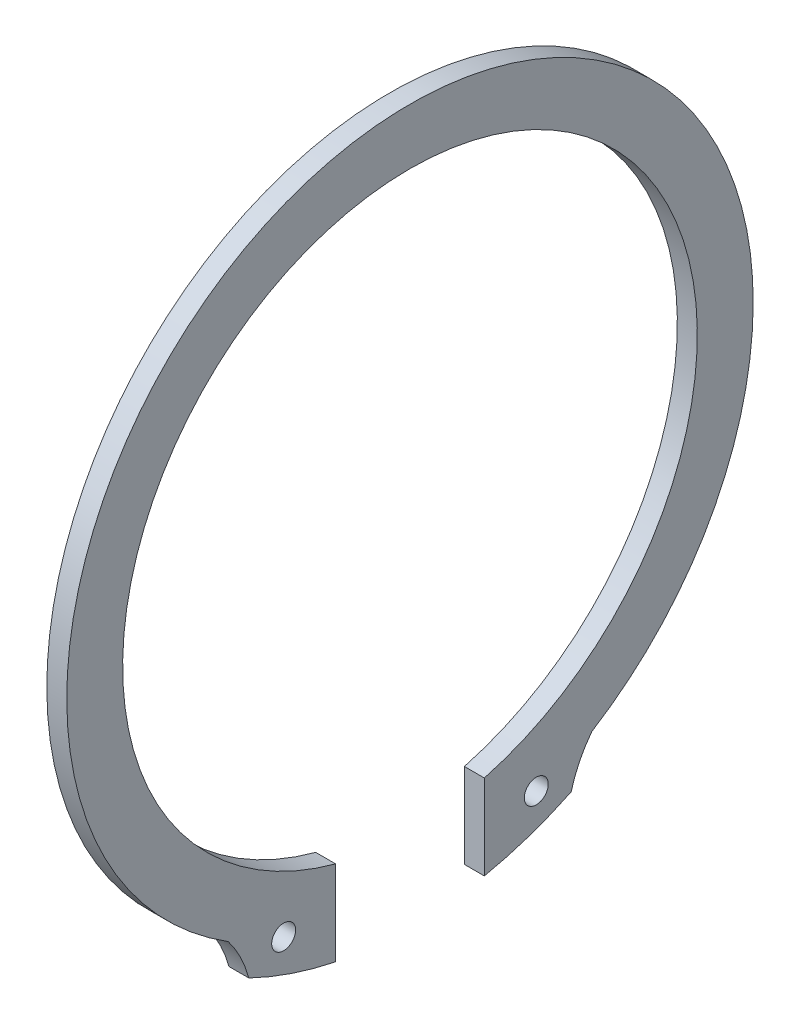
ISO-10303-21;
HEADER;
FILE_DESCRIPTION(('STEP AP214'),'2;1');
FILE_NAME('part.step','',(''),(''),'','','');
FILE_SCHEMA(('AUTOMOTIVE_DESIGN { 1 0 10303 214 1 1 1 1 }'));
ENDSEC;
DATA;
#1=APPLICATION_CONTEXT('core data for automotive mechanical design processes');
#2=APPLICATION_PROTOCOL_DEFINITION('international standard','automotive_design',2000,#1);
#3=PRODUCT_CONTEXT('',#1,'mechanical');
#4=PRODUCT('Part','Part','',(#3));
#5=PRODUCT_RELATED_PRODUCT_CATEGORY('part','',(#4));
#6=PRODUCT_DEFINITION_FORMATION('','',#4);
#7=PRODUCT_DEFINITION_CONTEXT('part definition',#1,'design');
#8=PRODUCT_DEFINITION('design','',#6,#7);
#9=PRODUCT_DEFINITION_SHAPE('','',#8);
#10=(LENGTH_UNIT() NAMED_UNIT(*) SI_UNIT(.MILLI.,.METRE.));
#11=(NAMED_UNIT(*) PLANE_ANGLE_UNIT() SI_UNIT($,.RADIAN.));
#12=(NAMED_UNIT(*) SI_UNIT($,.STERADIAN.) SOLID_ANGLE_UNIT());
#13=UNCERTAINTY_MEASURE_WITH_UNIT(LENGTH_MEASURE(1.E-05),#10,'distance_accuracy_value','');
#14=(GEOMETRIC_REPRESENTATION_CONTEXT(3) GLOBAL_UNCERTAINTY_ASSIGNED_CONTEXT((#13)) GLOBAL_UNIT_ASSIGNED_CONTEXT((#10,
#11,#12)) REPRESENTATION_CONTEXT('',''));
#15=CARTESIAN_POINT('',(0.,0.,0.));
#16=DIRECTION('',(0.,0.,1.));
#17=DIRECTION('',(1.,0.,0.));
#18=AXIS2_PLACEMENT_3D('',#15,#16,#17);
#19=CARTESIAN_POINT('',(2.5,-45.597809338552,-34.6843091234656));
#20=DIRECTION('',(-1.,0.,0.));
#21=DIRECTION('',(0.,0.,1.));
#22=AXIS2_PLACEMENT_3D('',#19,#20,#21);
#23=PLANE('',#22);
#24=CARTESIAN_POINT('',(2.5,-45.597809338552,-34.6843091234656));
#25=DIRECTION('',(-1.,0.,0.));
#26=DIRECTION('',(0.,0.,1.));
#27=AXIS2_PLACEMENT_3D('',#24,#25,#26);
#28=CIRCLE('',#27,15.);
#29=CARTESIAN_POINT('',(2.5,-41.7194142329984,-20.1943798135891));
#30=VERTEX_POINT('',#29);
#31=CARTESIAN_POINT('',(2.5,-36.46879680938,-22.7821609878464));
#32=VERTEX_POINT('',#31);
#33=EDGE_CURVE('E164',#30,#32,#28,.T.);
#34=ORIENTED_EDGE('',*,*,#33,.T.);
#35=CARTESIAN_POINT('',(2.5,0.,0.));
#36=DIRECTION('',(1.,0.,0.));
#37=DIRECTION('',(0.,0.,-1.));
#38=AXIS2_PLACEMENT_3D('',#35,#36,#37);
#39=CIRCLE('',#38,43.);
#40=CARTESIAN_POINT('',(2.5,-36.46879680938,22.7821609878464));
#41=VERTEX_POINT('',#40);
#42=EDGE_CURVE('E100',#32,#41,#39,.T.);
#43=ORIENTED_EDGE('',*,*,#42,.T.);
#44=CARTESIAN_POINT('',(2.5,-45.597809338552,34.6843091234656));
#45=DIRECTION('',(-1.,0.,0.));
#46=DIRECTION('',(0.,0.,-1.));
#47=AXIS2_PLACEMENT_3D('',#44,#45,#46);
#48=CIRCLE('',#47,15.);
#49=CARTESIAN_POINT('',(2.5,-41.7194142329984,20.1943798135891));
#50=VERTEX_POINT('',#49);
#51=EDGE_CURVE('E185',#41,#50,#48,.T.);
#52=ORIENTED_EDGE('',*,*,#51,.T.);
#53=CARTESIAN_POINT('',(2.5,0.,0.));
#54=DIRECTION('',(1.,0.,0.));
#55=DIRECTION('',(0.,0.,-1.));
#56=AXIS2_PLACEMENT_3D('',#53,#54,#55);
#57=CIRCLE('',#56,46.35);
#58=CARTESIAN_POINT('',(2.5,-45.4038210027781,9.31748562369076));
#59=VERTEX_POINT('',#58);
#60=EDGE_CURVE('E199',#50,#59,#57,.T.);
#61=ORIENTED_EDGE('',*,*,#60,.T.);
#62=DIRECTION('',(0.,1.,0.));
#63=VECTOR('',#62,1.);
#64=CARTESIAN_POINT('',(2.5,-34.7733297464064,9.31748562369077));
#65=LINE('',#64,#63);
#66=CARTESIAN_POINT('',(2.5,-34.7733297464065,9.31748562369074));
#67=VERTEX_POINT('',#66);
#68=EDGE_CURVE('E119',#59,#67,#65,.T.);
#69=ORIENTED_EDGE('',*,*,#68,.T.);
#70=CARTESIAN_POINT('',(2.5,0.,0.));
#71=DIRECTION('',(-1.,0.,0.));
#72=DIRECTION('',(0.,0.,-1.));
#73=AXIS2_PLACEMENT_3D('',#70,#71,#72);
#74=CIRCLE('',#73,36.);
#75=CARTESIAN_POINT('',(2.5,-34.7733297464064,-9.31748562369077));
#76=VERTEX_POINT('',#75);
#77=EDGE_CURVE('E113',#67,#76,#74,.T.);
#78=ORIENTED_EDGE('',*,*,#77,.T.);
#79=DIRECTION('',(0.,-1.,0.));
#80=VECTOR('',#79,1.);
#81=CARTESIAN_POINT('',(2.5,-34.7733297464064,-9.31748562369077));
#82=LINE('',#81,#80);
#83=CARTESIAN_POINT('',(2.5,-45.4038210027781,-9.31748562369079));
#84=VERTEX_POINT('',#83);
#85=EDGE_CURVE('E117',#76,#84,#82,.T.);
#86=ORIENTED_EDGE('',*,*,#85,.T.);
#87=CARTESIAN_POINT('',(2.5,0.,0.));
#88=DIRECTION('',(1.,0.,0.));
#89=DIRECTION('',(0.,0.,1.));
#90=AXIS2_PLACEMENT_3D('',#87,#88,#89);
#91=CIRCLE('',#90,46.35);
#92=EDGE_CURVE('E57',#84,#30,#91,.T.);
#93=ORIENTED_EDGE('',*,*,#92,.T.);
#94=EDGE_LOOP('',(#34,#43,#52,#61,#69,#78,#86,#93));
#95=FACE_BOUND('',#94,.T.);
#96=CARTESIAN_POINT('',(2.5,-39.4410576467848,15.8260546863128));
#97=DIRECTION('',(1.,0.,0.));
#98=DIRECTION('',(0.,0.,-1.));
#99=AXIS2_PLACEMENT_3D('',#96,#97,#98);
#100=CIRCLE('',#99,1.5);
#101=CARTESIAN_POINT('',(2.5,-39.4410576467848,14.3260546863128));
#102=VERTEX_POINT('',#101);
#103=EDGE_CURVE('E146',#102,#102,#100,.T.);
#104=ORIENTED_EDGE('',*,*,#103,.F.);
#105=EDGE_LOOP('',(#104));
#106=FACE_BOUND('',#105,.T.);
#107=CARTESIAN_POINT('',(2.5,-39.4410576467848,-15.8260546863128));
#108=DIRECTION('',(1.,0.,0.));
#109=DIRECTION('',(0.,0.,1.));
#110=AXIS2_PLACEMENT_3D('',#107,#108,#109);
#111=CIRCLE('',#110,1.5);
#112=CARTESIAN_POINT('',(2.5,-39.4410576467848,-14.3260546863128));
#113=VERTEX_POINT('',#112);
#114=EDGE_CURVE('E213',#113,#113,#111,.T.);
#115=ORIENTED_EDGE('',*,*,#114,.F.);
#116=EDGE_LOOP('',(#115));
#117=FACE_BOUND('',#116,.T.);
#118=ADVANCED_FACE('F39',(#95,#106,#117),#23,.F.);
#119=CARTESIAN_POINT('',(0.,-45.597809338552,-34.6843091234656));
#120=DIRECTION('',(-1.,0.,0.));
#121=DIRECTION('',(0.,0.,1.));
#122=AXIS2_PLACEMENT_3D('',#119,#120,#121);
#123=PLANE('',#122);
#124=CARTESIAN_POINT('',(0.,-39.4410576467848,15.8260546863128));
#125=DIRECTION('',(1.,0.,0.));
#126=DIRECTION('',(0.,0.,-1.));
#127=AXIS2_PLACEMENT_3D('',#124,#125,#126);
#128=CIRCLE('',#127,1.5);
#129=CARTESIAN_POINT('',(0.,-39.4410576467848,14.3260546863128));
#130=VERTEX_POINT('',#129);
#131=EDGE_CURVE('E209',#130,#130,#128,.T.);
#132=ORIENTED_EDGE('',*,*,#131,.T.);
#133=EDGE_LOOP('',(#132));
#134=FACE_BOUND('',#133,.T.);
#135=CARTESIAN_POINT('',(0.,-45.597809338552,-34.6843091234656));
#136=DIRECTION('',(-1.,0.,0.));
#137=DIRECTION('',(0.,0.,1.));
#138=AXIS2_PLACEMENT_3D('',#135,#136,#137);
#139=CIRCLE('',#138,15.);
#140=CARTESIAN_POINT('',(0.,-41.7194142329984,-20.1943798135891));
#141=VERTEX_POINT('',#140);
#142=CARTESIAN_POINT('',(0.,-36.46879680938,-22.7821609878464));
#143=VERTEX_POINT('',#142);
#144=EDGE_CURVE('E141',#141,#143,#139,.T.);
#145=ORIENTED_EDGE('',*,*,#144,.F.);
#146=CARTESIAN_POINT('',(0.,0.,0.));
#147=DIRECTION('',(1.,0.,0.));
#148=DIRECTION('',(0.,0.,1.));
#149=AXIS2_PLACEMENT_3D('',#146,#147,#148);
#150=CIRCLE('',#149,46.35);
#151=CARTESIAN_POINT('',(0.,-45.4038210027781,-9.31748562369079));
#152=VERTEX_POINT('',#151);
#153=EDGE_CURVE('E92',#152,#141,#150,.T.);
#154=ORIENTED_EDGE('',*,*,#153,.F.);
#155=DIRECTION('',(0.,-1.,0.));
#156=VECTOR('',#155,1.);
#157=CARTESIAN_POINT('',(0.,-34.7733297464064,-9.31748562369077));
#158=LINE('',#157,#156);
#159=CARTESIAN_POINT('',(0.,-34.7733297464064,-9.31748562369077));
#160=VERTEX_POINT('',#159);
#161=EDGE_CURVE('E86',#160,#152,#158,.T.);
#162=ORIENTED_EDGE('',*,*,#161,.F.);
#163=CARTESIAN_POINT('',(0.,0.,0.));
#164=DIRECTION('',(-1.,0.,0.));
#165=DIRECTION('',(0.,0.,-1.));
#166=AXIS2_PLACEMENT_3D('',#163,#164,#165);
#167=CIRCLE('',#166,36.);
#168=CARTESIAN_POINT('',(0.,-34.7733297464065,9.31748562369074));
#169=VERTEX_POINT('',#168);
#170=EDGE_CURVE('E128',#169,#160,#167,.T.);
#171=ORIENTED_EDGE('',*,*,#170,.F.);
#172=DIRECTION('',(0.,1.,0.));
#173=VECTOR('',#172,1.);
#174=CARTESIAN_POINT('',(0.,-34.7733297464064,9.31748562369077));
#175=LINE('',#174,#173);
#176=CARTESIAN_POINT('',(0.,-45.4038210027781,9.31748562369076));
#177=VERTEX_POINT('',#176);
#178=EDGE_CURVE('E155',#177,#169,#175,.T.);
#179=ORIENTED_EDGE('',*,*,#178,.F.);
#180=CARTESIAN_POINT('',(0.,0.,0.));
#181=DIRECTION('',(1.,0.,0.));
#182=DIRECTION('',(0.,0.,-1.));
#183=AXIS2_PLACEMENT_3D('',#180,#181,#182);
#184=CIRCLE('',#183,46.35);
#185=CARTESIAN_POINT('',(0.,-41.7194142329984,20.1943798135891));
#186=VERTEX_POINT('',#185);
#187=EDGE_CURVE('E152',#186,#177,#184,.T.);
#188=ORIENTED_EDGE('',*,*,#187,.F.);
#189=CARTESIAN_POINT('',(0.,-45.597809338552,34.6843091234656));
#190=DIRECTION('',(-1.,0.,0.));
#191=DIRECTION('',(0.,0.,-1.));
#192=AXIS2_PLACEMENT_3D('',#189,#190,#191);
#193=CIRCLE('',#192,15.);
#194=CARTESIAN_POINT('',(0.,-36.46879680938,22.7821609878464));
#195=VERTEX_POINT('',#194);
#196=EDGE_CURVE('E149',#195,#186,#193,.T.);
#197=ORIENTED_EDGE('',*,*,#196,.F.);
#198=CARTESIAN_POINT('',(0.,0.,0.));
#199=DIRECTION('',(1.,0.,0.));
#200=DIRECTION('',(0.,0.,-1.));
#201=AXIS2_PLACEMENT_3D('',#198,#199,#200);
#202=CIRCLE('',#201,43.);
#203=EDGE_CURVE('E145',#143,#195,#202,.T.);
#204=ORIENTED_EDGE('',*,*,#203,.F.);
#205=EDGE_LOOP('',(#145,#154,#162,#171,#179,#188,#197,#204));
#206=FACE_BOUND('',#205,.T.);
#207=CARTESIAN_POINT('',(0.,-39.4410576467848,-15.8260546863128));
#208=DIRECTION('',(1.,0.,0.));
#209=DIRECTION('',(0.,0.,1.));
#210=AXIS2_PLACEMENT_3D('',#207,#208,#209);
#211=CIRCLE('',#210,1.5);
#212=CARTESIAN_POINT('',(0.,-39.4410576467848,-14.3260546863128));
#213=VERTEX_POINT('',#212);
#214=EDGE_CURVE('E217',#213,#213,#211,.T.);
#215=ORIENTED_EDGE('',*,*,#214,.T.);
#216=EDGE_LOOP('',(#215));
#217=FACE_BOUND('',#216,.T.);
#218=ADVANCED_FACE('F189',(#134,#206,#217),#123,.T.);
#219=CARTESIAN_POINT('',(2.5,-45.597809338552,-34.6843091234656));
#220=DIRECTION('',(-1.,0.,0.));
#221=DIRECTION('',(0.,0.,1.));
#222=AXIS2_PLACEMENT_3D('',#219,#220,#221);
#223=CYLINDRICAL_SURFACE('',#222,15.);
#224=ORIENTED_EDGE('',*,*,#144,.T.);
#225=DIRECTION('',(-1.,0.,0.));
#226=VECTOR('',#225,1.);
#227=CARTESIAN_POINT('',(2.5,-36.46879680938,-22.7821609878464));
#228=LINE('',#227,#226);
#229=EDGE_CURVE('E11',#32,#143,#228,.T.);
#230=ORIENTED_EDGE('',*,*,#229,.F.);
#231=ORIENTED_EDGE('',*,*,#33,.F.);
#232=DIRECTION('',(-1.,0.,0.));
#233=VECTOR('',#232,1.);
#234=CARTESIAN_POINT('',(2.5,-41.7194142329984,-20.1943798135891));
#235=LINE('',#234,#233);
#236=EDGE_CURVE('E137',#30,#141,#235,.T.);
#237=ORIENTED_EDGE('',*,*,#236,.T.);
#238=EDGE_LOOP('',(#224,#230,#231,#237));
#239=FACE_BOUND('',#238,.T.);
#240=ADVANCED_FACE('F41',(#239),#223,.F.);
#241=CARTESIAN_POINT('',(2.5,0.,0.));
#242=DIRECTION('',(-1.,0.,0.));
#243=DIRECTION('',(0.,0.,1.));
#244=AXIS2_PLACEMENT_3D('',#241,#242,#243);
#245=CYLINDRICAL_SURFACE('',#244,43.);
#246=ORIENTED_EDGE('',*,*,#203,.T.);
#247=DIRECTION('',(-1.,0.,0.));
#248=VECTOR('',#247,1.);
#249=CARTESIAN_POINT('',(2.5,-36.46879680938,22.7821609878464));
#250=LINE('',#249,#248);
#251=EDGE_CURVE('E49',#41,#195,#250,.T.);
#252=ORIENTED_EDGE('',*,*,#251,.F.);
#253=ORIENTED_EDGE('',*,*,#42,.F.);
#254=ORIENTED_EDGE('',*,*,#229,.T.);
#255=EDGE_LOOP('',(#246,#252,#253,#254));
#256=FACE_BOUND('',#255,.T.);
#257=ADVANCED_FACE('F251',(#256),#245,.T.);
#258=CARTESIAN_POINT('',(2.5,-45.597809338552,34.6843091234656));
#259=DIRECTION('',(-1.,0.,0.));
#260=DIRECTION('',(0.,0.,1.));
#261=AXIS2_PLACEMENT_3D('',#258,#259,#260);
#262=CYLINDRICAL_SURFACE('',#261,15.);
#263=ORIENTED_EDGE('',*,*,#196,.T.);
#264=DIRECTION('',(-1.,0.,0.));
#265=VECTOR('',#264,1.);
#266=CARTESIAN_POINT('',(2.5,-41.7194142329984,20.1943798135891));
#267=LINE('',#266,#265);
#268=EDGE_CURVE('E175',#50,#186,#267,.T.);
#269=ORIENTED_EDGE('',*,*,#268,.F.);
#270=ORIENTED_EDGE('',*,*,#51,.F.);
#271=ORIENTED_EDGE('',*,*,#251,.T.);
#272=EDGE_LOOP('',(#263,#269,#270,#271));
#273=FACE_BOUND('',#272,.T.);
#274=ADVANCED_FACE('F183',(#273),#262,.F.);
#275=CARTESIAN_POINT('',(2.5,0.,0.));
#276=DIRECTION('',(-1.,0.,0.));
#277=DIRECTION('',(0.,0.,1.));
#278=AXIS2_PLACEMENT_3D('',#275,#276,#277);
#279=CYLINDRICAL_SURFACE('',#278,46.35);
#280=ORIENTED_EDGE('',*,*,#187,.T.);
#281=DIRECTION('',(-1.,0.,0.));
#282=VECTOR('',#281,1.);
#283=CARTESIAN_POINT('',(2.5,-45.4038210027781,9.31748562369076));
#284=LINE('',#283,#282);
#285=EDGE_CURVE('E171',#59,#177,#284,.T.);
#286=ORIENTED_EDGE('',*,*,#285,.F.);
#287=ORIENTED_EDGE('',*,*,#60,.F.);
#288=ORIENTED_EDGE('',*,*,#268,.T.);
#289=EDGE_LOOP('',(#280,#286,#287,#288));
#290=FACE_BOUND('',#289,.T.);
#291=ADVANCED_FACE('F194',(#290),#279,.T.);
#292=CARTESIAN_POINT('',(2.5,-34.7733297464064,9.31748562369077));
#293=DIRECTION('',(0.,0.,1.));
#294=DIRECTION('',(0.,-1.,0.));
#295=AXIS2_PLACEMENT_3D('',#292,#293,#294);
#296=PLANE('',#295);
#297=ORIENTED_EDGE('',*,*,#178,.T.);
#298=DIRECTION('',(-1.,0.,0.));
#299=VECTOR('',#298,1.);
#300=CARTESIAN_POINT('',(2.5,-34.7733297464065,9.31748562369074));
#301=LINE('',#300,#299);
#302=EDGE_CURVE('E130',#67,#169,#301,.T.);
#303=ORIENTED_EDGE('',*,*,#302,.F.);
#304=ORIENTED_EDGE('',*,*,#68,.F.);
#305=ORIENTED_EDGE('',*,*,#285,.T.);
#306=EDGE_LOOP('',(#297,#303,#304,#305));
#307=FACE_BOUND('',#306,.T.);
#308=ADVANCED_FACE('F197',(#307),#296,.F.);
#309=CARTESIAN_POINT('',(2.5,0.,0.));
#310=DIRECTION('',(-1.,0.,0.));
#311=DIRECTION('',(0.,0.,1.));
#312=AXIS2_PLACEMENT_3D('',#309,#310,#311);
#313=CYLINDRICAL_SURFACE('',#312,36.);
#314=ORIENTED_EDGE('',*,*,#170,.T.);
#315=DIRECTION('',(-1.,0.,0.));
#316=VECTOR('',#315,1.);
#317=CARTESIAN_POINT('',(2.5,-34.7733297464064,-9.31748562369077));
#318=LINE('',#317,#316);
#319=EDGE_CURVE('E125',#76,#160,#318,.T.);
#320=ORIENTED_EDGE('',*,*,#319,.F.);
#321=ORIENTED_EDGE('',*,*,#77,.F.);
#322=ORIENTED_EDGE('',*,*,#302,.T.);
#323=EDGE_LOOP('',(#314,#320,#321,#322));
#324=FACE_BOUND('',#323,.T.);
#325=ADVANCED_FACE('F126',(#324),#313,.F.);
#326=CARTESIAN_POINT('',(2.5,-34.7733297464064,-9.31748562369077));
#327=DIRECTION('',(0.,0.,-1.));
#328=DIRECTION('',(-1.,0.,0.));
#329=AXIS2_PLACEMENT_3D('',#326,#327,#328);
#330=PLANE('',#329);
#331=ORIENTED_EDGE('',*,*,#161,.T.);
#332=DIRECTION('',(-1.,0.,0.));
#333=VECTOR('',#332,1.);
#334=CARTESIAN_POINT('',(2.5,-45.4038210027781,-9.31748562369079));
#335=LINE('',#334,#333);
#336=EDGE_CURVE('E131',#84,#152,#335,.T.);
#337=ORIENTED_EDGE('',*,*,#336,.F.);
#338=ORIENTED_EDGE('',*,*,#85,.F.);
#339=ORIENTED_EDGE('',*,*,#319,.T.);
#340=EDGE_LOOP('',(#331,#337,#338,#339));
#341=FACE_BOUND('',#340,.T.);
#342=ADVANCED_FACE('F133',(#341),#330,.F.);
#343=CARTESIAN_POINT('',(2.5,0.,0.));
#344=DIRECTION('',(-1.,0.,0.));
#345=DIRECTION('',(0.,0.,1.));
#346=AXIS2_PLACEMENT_3D('',#343,#344,#345);
#347=CYLINDRICAL_SURFACE('',#346,46.35);
#348=ORIENTED_EDGE('',*,*,#153,.T.);
#349=ORIENTED_EDGE('',*,*,#236,.F.);
#350=ORIENTED_EDGE('',*,*,#92,.F.);
#351=ORIENTED_EDGE('',*,*,#336,.T.);
#352=EDGE_LOOP('',(#348,#349,#350,#351));
#353=FACE_BOUND('',#352,.T.);
#354=ADVANCED_FACE('F239',(#353),#347,.T.);
#355=CARTESIAN_POINT('',(2.5,-39.4410576467848,15.8260546863128));
#356=DIRECTION('',(-1.,0.,0.));
#357=DIRECTION('',(0.,0.,1.));
#358=AXIS2_PLACEMENT_3D('',#355,#356,#357);
#359=CYLINDRICAL_SURFACE('',#358,1.5);
#360=ORIENTED_EDGE('',*,*,#103,.T.);
#361=EDGE_LOOP('',(#360));
#362=FACE_BOUND('',#361,.T.);
#363=ORIENTED_EDGE('',*,*,#131,.F.);
#364=EDGE_LOOP('',(#363));
#365=FACE_BOUND('',#364,.T.);
#366=ADVANCED_FACE('F236',(#362,#365),#359,.F.);
#367=CARTESIAN_POINT('',(2.5,-39.4410576467848,-15.8260546863128));
#368=DIRECTION('',(-1.,0.,0.));
#369=DIRECTION('',(0.,0.,1.));
#370=AXIS2_PLACEMENT_3D('',#367,#368,#369);
#371=CYLINDRICAL_SURFACE('',#370,1.5);
#372=ORIENTED_EDGE('',*,*,#114,.T.);
#373=EDGE_LOOP('',(#372));
#374=FACE_BOUND('',#373,.T.);
#375=ORIENTED_EDGE('',*,*,#214,.F.);
#376=EDGE_LOOP('',(#375));
#377=FACE_BOUND('',#376,.T.);
#378=ADVANCED_FACE('F225',(#374,#377),#371,.F.);
#379=CLOSED_SHELL('',(#118,#218,#240,#257,#274,#291,#308,#325,#342,#354,#366,#378));
#380=MANIFOLD_SOLID_BREP('B2',#379);
#381=ADVANCED_BREP_SHAPE_REPRESENTATION('',(#18,#380),#14);
#382=SHAPE_DEFINITION_REPRESENTATION(#9,#381);
ENDSEC;
END-ISO-10303-21;
